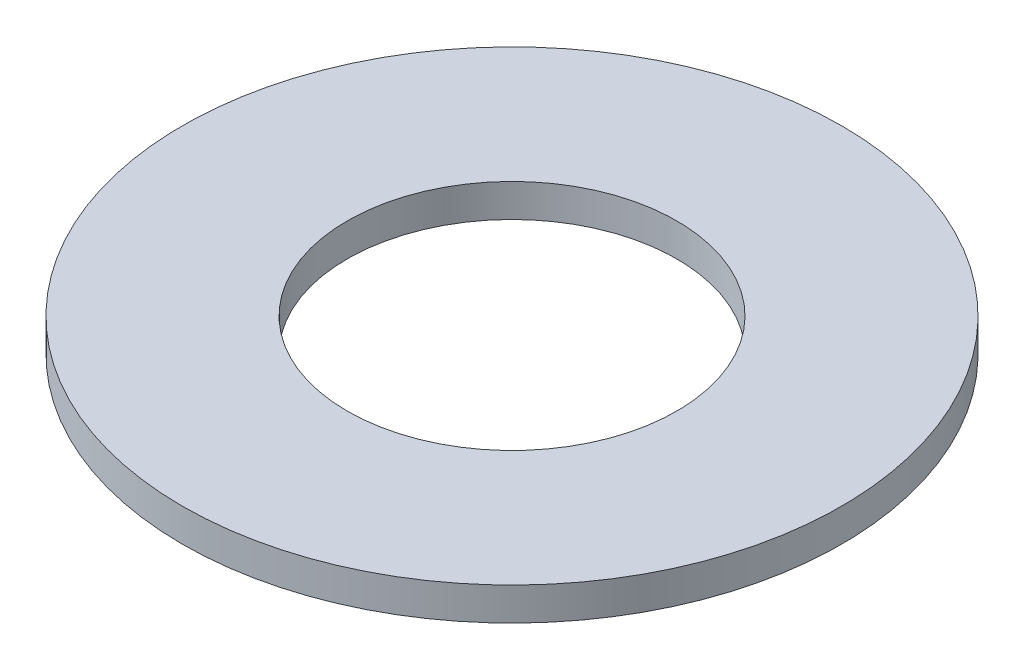
ISO-10303-21;
HEADER;
FILE_DESCRIPTION(('STEP AP214'),'2;1');
FILE_NAME('part.step','',(''),(''),'','','');
FILE_SCHEMA(('AUTOMOTIVE_DESIGN { 1 0 10303 214 1 1 1 1 }'));
ENDSEC;
DATA;
#1=APPLICATION_CONTEXT('core data for automotive mechanical design processes');
#2=APPLICATION_PROTOCOL_DEFINITION('international standard','automotive_design',2000,#1);
#3=PRODUCT_CONTEXT('',#1,'mechanical');
#4=PRODUCT('Part','Part','',(#3));
#5=PRODUCT_RELATED_PRODUCT_CATEGORY('part','',(#4));
#6=PRODUCT_DEFINITION_FORMATION('','',#4);
#7=PRODUCT_DEFINITION_CONTEXT('part definition',#1,'design');
#8=PRODUCT_DEFINITION('design','',#6,#7);
#9=PRODUCT_DEFINITION_SHAPE('','',#8);
#10=(LENGTH_UNIT() NAMED_UNIT(*) SI_UNIT(.MILLI.,.METRE.));
#11=(NAMED_UNIT(*) PLANE_ANGLE_UNIT() SI_UNIT($,.RADIAN.));
#12=(NAMED_UNIT(*) SI_UNIT($,.STERADIAN.) SOLID_ANGLE_UNIT());
#13=UNCERTAINTY_MEASURE_WITH_UNIT(LENGTH_MEASURE(1.E-05),#10,'distance_accuracy_value','');
#14=(GEOMETRIC_REPRESENTATION_CONTEXT(3) GLOBAL_UNCERTAINTY_ASSIGNED_CONTEXT((#13)) GLOBAL_UNIT_ASSIGNED_CONTEXT((#10,
#11,#12)) REPRESENTATION_CONTEXT('',''));
#15=CARTESIAN_POINT('',(0.,0.,0.));
#16=DIRECTION('',(0.,0.,1.));
#17=DIRECTION('',(1.,0.,0.));
#18=AXIS2_PLACEMENT_3D('',#15,#16,#17);
#19=CARTESIAN_POINT('',(0.,2.54,0.));
#20=DIRECTION('',(0.,1.,0.));
#21=DIRECTION('',(0.,0.,1.));
#22=AXIS2_PLACEMENT_3D('',#19,#20,#21);
#23=PLANE('',#22);
#24=CARTESIAN_POINT('',(0.,2.54,0.));
#25=DIRECTION('',(0.,1.,0.));
#26=DIRECTION('',(0.,0.,1.));
#27=AXIS2_PLACEMENT_3D('',#24,#25,#26);
#28=CIRCLE('',#27,25.4);
#29=CARTESIAN_POINT('',(0.,2.54,25.4));
#30=VERTEX_POINT('',#29);
#31=EDGE_CURVE('E10',#30,#30,#28,.T.);
#32=ORIENTED_EDGE('',*,*,#31,.T.);
#33=EDGE_LOOP('',(#32));
#34=FACE_BOUND('',#33,.T.);
#35=CARTESIAN_POINT('',(0.,2.54,0.));
#36=DIRECTION('',(0.,1.,0.));
#37=DIRECTION('',(0.,0.,1.));
#38=AXIS2_PLACEMENT_3D('',#35,#36,#37);
#39=CIRCLE('',#38,12.7);
#40=CARTESIAN_POINT('',(0.,2.54,12.7));
#41=VERTEX_POINT('',#40);
#42=EDGE_CURVE('E42',#41,#41,#39,.T.);
#43=ORIENTED_EDGE('',*,*,#42,.F.);
#44=EDGE_LOOP('',(#43));
#45=FACE_BOUND('',#44,.T.);
#46=ADVANCED_FACE('F31',(#34,#45),#23,.T.);
#47=CARTESIAN_POINT('',(0.,0.,0.));
#48=DIRECTION('',(0.,1.,0.));
#49=DIRECTION('',(0.,0.,1.));
#50=AXIS2_PLACEMENT_3D('',#47,#48,#49);
#51=PLANE('',#50);
#52=CARTESIAN_POINT('',(0.,0.,0.));
#53=DIRECTION('',(0.,1.,0.));
#54=DIRECTION('',(0.,0.,1.));
#55=AXIS2_PLACEMENT_3D('',#52,#53,#54);
#56=CIRCLE('',#55,25.4);
#57=CARTESIAN_POINT('',(0.,0.,25.4));
#58=VERTEX_POINT('',#57);
#59=EDGE_CURVE('E35',#58,#58,#56,.T.);
#60=ORIENTED_EDGE('',*,*,#59,.F.);
#61=EDGE_LOOP('',(#60));
#62=FACE_BOUND('',#61,.T.);
#63=CARTESIAN_POINT('',(0.,0.,0.));
#64=DIRECTION('',(0.,1.,0.));
#65=DIRECTION('',(0.,0.,1.));
#66=AXIS2_PLACEMENT_3D('',#63,#64,#65);
#67=CIRCLE('',#66,12.7);
#68=CARTESIAN_POINT('',(0.,0.,12.7));
#69=VERTEX_POINT('',#68);
#70=EDGE_CURVE('E44',#69,#69,#67,.T.);
#71=ORIENTED_EDGE('',*,*,#70,.T.);
#72=EDGE_LOOP('',(#71));
#73=FACE_BOUND('',#72,.T.);
#74=ADVANCED_FACE('F54',(#62,#73),#51,.F.);
#75=CARTESIAN_POINT('',(0.,2.54,0.));
#76=DIRECTION('',(0.,-1.,0.));
#77=DIRECTION('',(0.,0.,-1.));
#78=AXIS2_PLACEMENT_3D('',#75,#76,#77);
#79=CYLINDRICAL_SURFACE('',#78,25.4);
#80=ORIENTED_EDGE('',*,*,#31,.F.);
#81=EDGE_LOOP('',(#80));
#82=FACE_BOUND('',#81,.T.);
#83=ORIENTED_EDGE('',*,*,#59,.T.);
#84=EDGE_LOOP('',(#83));
#85=FACE_BOUND('',#84,.T.);
#86=ADVANCED_FACE('F33',(#82,#85),#79,.T.);
#87=CARTESIAN_POINT('',(0.,2.54,0.));
#88=DIRECTION('',(0.,-1.,0.));
#89=DIRECTION('',(0.,0.,-1.));
#90=AXIS2_PLACEMENT_3D('',#87,#88,#89);
#91=CYLINDRICAL_SURFACE('',#90,12.7);
#92=ORIENTED_EDGE('',*,*,#42,.T.);
#93=EDGE_LOOP('',(#92));
#94=FACE_BOUND('',#93,.T.);
#95=ORIENTED_EDGE('',*,*,#70,.F.);
#96=EDGE_LOOP('',(#95));
#97=FACE_BOUND('',#96,.T.);
#98=ADVANCED_FACE('F50',(#94,#97),#91,.F.);
#99=CLOSED_SHELL('',(#46,#74,#86,#98));
#100=MANIFOLD_SOLID_BREP('B2',#99);
#101=ADVANCED_BREP_SHAPE_REPRESENTATION('',(#18,#100),#14);
#102=SHAPE_DEFINITION_REPRESENTATION(#9,#101);
ENDSEC;
END-ISO-10303-21;
